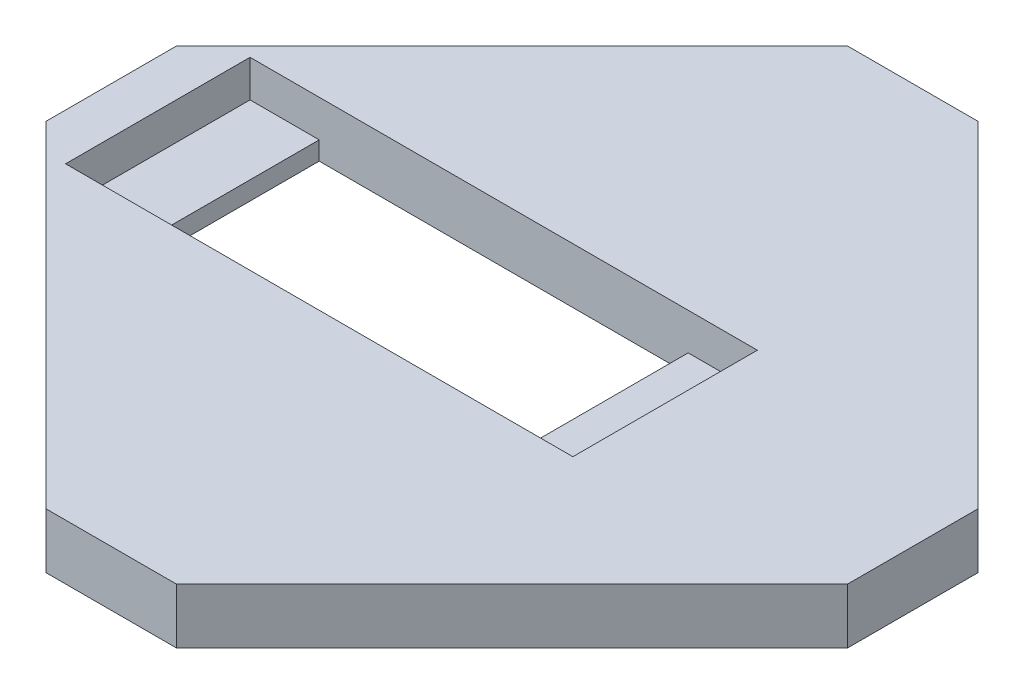
ISO-10303-21;
HEADER;
FILE_DESCRIPTION(('STEP AP214'),'2;1');
FILE_NAME('part.step','',(''),(''),'','','');
FILE_SCHEMA(('AUTOMOTIVE_DESIGN { 1 0 10303 214 1 1 1 1 }'));
ENDSEC;
DATA;
#1=APPLICATION_CONTEXT('core data for automotive mechanical design processes');
#2=APPLICATION_PROTOCOL_DEFINITION('international standard','automotive_design',2000,#1);
#3=PRODUCT_CONTEXT('',#1,'mechanical');
#4=PRODUCT('Part','Part','',(#3));
#5=PRODUCT_RELATED_PRODUCT_CATEGORY('part','',(#4));
#6=PRODUCT_DEFINITION_FORMATION('','',#4);
#7=PRODUCT_DEFINITION_CONTEXT('part definition',#1,'design');
#8=PRODUCT_DEFINITION('design','',#6,#7);
#9=PRODUCT_DEFINITION_SHAPE('','',#8);
#10=(LENGTH_UNIT() NAMED_UNIT(*) SI_UNIT(.MILLI.,.METRE.));
#11=(NAMED_UNIT(*) PLANE_ANGLE_UNIT() SI_UNIT($,.RADIAN.));
#12=(NAMED_UNIT(*) SI_UNIT($,.STERADIAN.) SOLID_ANGLE_UNIT());
#13=UNCERTAINTY_MEASURE_WITH_UNIT(LENGTH_MEASURE(1.E-05),#10,'distance_accuracy_value','');
#14=(GEOMETRIC_REPRESENTATION_CONTEXT(3) GLOBAL_UNCERTAINTY_ASSIGNED_CONTEXT((#13)) GLOBAL_UNIT_ASSIGNED_CONTEXT((#10,
#11,#12)) REPRESENTATION_CONTEXT('',''));
#15=CARTESIAN_POINT('',(0.,0.,0.));
#16=DIRECTION('',(0.,0.,1.));
#17=DIRECTION('',(1.,0.,0.));
#18=AXIS2_PLACEMENT_3D('',#15,#16,#17);
#19=CARTESIAN_POINT('',(0.,6.,-10.));
#20=DIRECTION('',(0.,0.,-1.));
#21=DIRECTION('',(-1.,0.,0.));
#22=AXIS2_PLACEMENT_3D('',#19,#20,#21);
#23=PLANE('',#22);
#24=DIRECTION('',(0.,-1.,0.));
#25=VECTOR('',#24,1.);
#26=CARTESIAN_POINT('',(-38.4,6.,-10.));
#27=LINE('',#26,#25);
#28=CARTESIAN_POINT('',(-38.4,6.,-10.));
#29=VERTEX_POINT('',#28);
#30=CARTESIAN_POINT('',(-38.4,2.,-10.));
#31=VERTEX_POINT('',#30);
#32=EDGE_CURVE('E178',#29,#31,#27,.T.);
#33=ORIENTED_EDGE('',*,*,#32,.T.);
#34=DIRECTION('',(1.,0.,0.));
#35=VECTOR('',#34,1.);
#36=CARTESIAN_POINT('',(0.,2.,-10.));
#37=LINE('',#36,#35);
#38=CARTESIAN_POINT('',(-30.9,2.,-10.));
#39=VERTEX_POINT('',#38);
#40=EDGE_CURVE('E171',#31,#39,#37,.T.);
#41=ORIENTED_EDGE('',*,*,#40,.T.);
#42=DIRECTION('',(0.,-1.,0.));
#43=VECTOR('',#42,1.);
#44=CARTESIAN_POINT('',(-30.9,2.,-10.));
#45=LINE('',#44,#43);
#46=CARTESIAN_POINT('',(-30.9,0.,-10.));
#47=VERTEX_POINT('',#46);
#48=EDGE_CURVE('E160',#39,#47,#45,.T.);
#49=ORIENTED_EDGE('',*,*,#48,.T.);
#50=DIRECTION('',(1.,0.,0.));
#51=VECTOR('',#50,1.);
#52=CARTESIAN_POINT('',(0.,0.,-10.));
#53=LINE('',#52,#51);
#54=CARTESIAN_POINT('',(9.1,0.,-10.));
#55=VERTEX_POINT('',#54);
#56=EDGE_CURVE('E203',#47,#55,#53,.T.);
#57=ORIENTED_EDGE('',*,*,#56,.T.);
#58=DIRECTION('',(0.,-1.,0.));
#59=VECTOR('',#58,1.);
#60=CARTESIAN_POINT('',(9.1,2.,-10.));
#61=LINE('',#60,#59);
#62=CARTESIAN_POINT('',(9.1,2.,-10.));
#63=VERTEX_POINT('',#62);
#64=EDGE_CURVE('E184',#63,#55,#61,.T.);
#65=ORIENTED_EDGE('',*,*,#64,.F.);
#66=DIRECTION('',(1.,0.,0.));
#67=VECTOR('',#66,1.);
#68=CARTESIAN_POINT('',(0.,2.,-10.));
#69=LINE('',#68,#67);
#70=CARTESIAN_POINT('',(16.6,2.,-10.));
#71=VERTEX_POINT('',#70);
#72=EDGE_CURVE('E190',#63,#71,#69,.T.);
#73=ORIENTED_EDGE('',*,*,#72,.T.);
#74=DIRECTION('',(0.,-1.,0.));
#75=VECTOR('',#74,1.);
#76=CARTESIAN_POINT('',(16.6,6.,-10.));
#77=LINE('',#76,#75);
#78=CARTESIAN_POINT('',(16.6,6.,-10.));
#79=VERTEX_POINT('',#78);
#80=EDGE_CURVE('E263',#79,#71,#77,.T.);
#81=ORIENTED_EDGE('',*,*,#80,.F.);
#82=DIRECTION('',(1.,0.,0.));
#83=VECTOR('',#82,1.);
#84=CARTESIAN_POINT('',(0.,6.,-10.));
#85=LINE('',#84,#83);
#86=EDGE_CURVE('E234',#29,#79,#85,.T.);
#87=ORIENTED_EDGE('',*,*,#86,.F.);
#88=EDGE_LOOP('',(#33,#41,#49,#57,#65,#73,#81,#87));
#89=FACE_BOUND('',#88,.T.);
#90=ADVANCED_FACE('F43',(#89),#23,.F.);
#91=CARTESIAN_POINT('',(16.6,6.,0.));
#92=DIRECTION('',(-1.,0.,0.));
#93=DIRECTION('',(0.,0.,1.));
#94=AXIS2_PLACEMENT_3D('',#91,#92,#93);
#95=PLANE('',#94);
#96=DIRECTION('',(0.,0.,-1.));
#97=VECTOR('',#96,1.);
#98=CARTESIAN_POINT('',(16.6,2.,0.));
#99=LINE('',#98,#97);
#100=CARTESIAN_POINT('',(16.6,2.,10.));
#101=VERTEX_POINT('',#100);
#102=EDGE_CURVE('E58',#101,#71,#99,.T.);
#103=ORIENTED_EDGE('',*,*,#102,.F.);
#104=DIRECTION('',(0.,-1.,0.));
#105=VECTOR('',#104,1.);
#106=CARTESIAN_POINT('',(16.6,6.,10.));
#107=LINE('',#106,#105);
#108=CARTESIAN_POINT('',(16.6,6.,10.));
#109=VERTEX_POINT('',#108);
#110=EDGE_CURVE('E11',#109,#101,#107,.T.);
#111=ORIENTED_EDGE('',*,*,#110,.F.);
#112=DIRECTION('',(0.,0.,-1.));
#113=VECTOR('',#112,1.);
#114=CARTESIAN_POINT('',(16.6,6.,0.));
#115=LINE('',#114,#113);
#116=EDGE_CURVE('E224',#109,#79,#115,.T.);
#117=ORIENTED_EDGE('',*,*,#116,.T.);
#118=ORIENTED_EDGE('',*,*,#80,.T.);
#119=EDGE_LOOP('',(#103,#111,#117,#118));
#120=FACE_BOUND('',#119,.T.);
#121=ADVANCED_FACE('F327',(#120),#95,.T.);
#122=CARTESIAN_POINT('',(0.,6.,10.));
#123=DIRECTION('',(0.,0.,-1.));
#124=DIRECTION('',(-1.,0.,0.));
#125=AXIS2_PLACEMENT_3D('',#122,#123,#124);
#126=PLANE('',#125);
#127=DIRECTION('',(0.,-1.,0.));
#128=VECTOR('',#127,1.);
#129=CARTESIAN_POINT('',(-30.9,2.,10.));
#130=LINE('',#129,#128);
#131=CARTESIAN_POINT('',(-30.9,2.,10.));
#132=VERTEX_POINT('',#131);
#133=CARTESIAN_POINT('',(-30.9,0.,10.));
#134=VERTEX_POINT('',#133);
#135=EDGE_CURVE('E170',#132,#134,#130,.T.);
#136=ORIENTED_EDGE('',*,*,#135,.F.);
#137=DIRECTION('',(1.,0.,0.));
#138=VECTOR('',#137,1.);
#139=CARTESIAN_POINT('',(0.,2.,10.));
#140=LINE('',#139,#138);
#141=CARTESIAN_POINT('',(-38.4,2.,10.));
#142=VERTEX_POINT('',#141);
#143=EDGE_CURVE('E172',#142,#132,#140,.T.);
#144=ORIENTED_EDGE('',*,*,#143,.F.);
#145=DIRECTION('',(0.,-1.,0.));
#146=VECTOR('',#145,1.);
#147=CARTESIAN_POINT('',(-38.4,6.,10.));
#148=LINE('',#147,#146);
#149=CARTESIAN_POINT('',(-38.4,6.,10.));
#150=VERTEX_POINT('',#149);
#151=EDGE_CURVE('E55',#150,#142,#148,.T.);
#152=ORIENTED_EDGE('',*,*,#151,.F.);
#153=DIRECTION('',(1.,0.,0.));
#154=VECTOR('',#153,1.);
#155=CARTESIAN_POINT('',(0.,6.,10.));
#156=LINE('',#155,#154);
#157=EDGE_CURVE('E226',#150,#109,#156,.T.);
#158=ORIENTED_EDGE('',*,*,#157,.T.);
#159=ORIENTED_EDGE('',*,*,#110,.T.);
#160=DIRECTION('',(1.,0.,0.));
#161=VECTOR('',#160,1.);
#162=CARTESIAN_POINT('',(0.,2.,10.));
#163=LINE('',#162,#161);
#164=CARTESIAN_POINT('',(9.1,2.,10.));
#165=VERTEX_POINT('',#164);
#166=EDGE_CURVE('E191',#165,#101,#163,.T.);
#167=ORIENTED_EDGE('',*,*,#166,.F.);
#168=DIRECTION('',(0.,-1.,0.));
#169=VECTOR('',#168,1.);
#170=CARTESIAN_POINT('',(9.1,2.,10.));
#171=LINE('',#170,#169);
#172=CARTESIAN_POINT('',(9.1,0.,10.));
#173=VERTEX_POINT('',#172);
#174=EDGE_CURVE('E192',#165,#173,#171,.T.);
#175=ORIENTED_EDGE('',*,*,#174,.T.);
#176=DIRECTION('',(1.,0.,0.));
#177=VECTOR('',#176,1.);
#178=CARTESIAN_POINT('',(0.,0.,10.));
#179=LINE('',#178,#177);
#180=EDGE_CURVE('E257',#134,#173,#179,.T.);
#181=ORIENTED_EDGE('',*,*,#180,.F.);
#182=EDGE_LOOP('',(#136,#144,#152,#158,#159,#167,#175,#181));
#183=FACE_BOUND('',#182,.T.);
#184=ADVANCED_FACE('F335',(#183),#126,.T.);
#185=CARTESIAN_POINT('',(-38.4,6.,0.));
#186=DIRECTION('',(-1.,0.,0.));
#187=DIRECTION('',(0.,0.,1.));
#188=AXIS2_PLACEMENT_3D('',#185,#186,#187);
#189=PLANE('',#188);
#190=ORIENTED_EDGE('',*,*,#151,.T.);
#191=DIRECTION('',(0.,0.,-1.));
#192=VECTOR('',#191,1.);
#193=CARTESIAN_POINT('',(-38.4,2.,0.));
#194=LINE('',#193,#192);
#195=EDGE_CURVE('E177',#142,#31,#194,.T.);
#196=ORIENTED_EDGE('',*,*,#195,.T.);
#197=ORIENTED_EDGE('',*,*,#32,.F.);
#198=DIRECTION('',(0.,0.,-1.));
#199=VECTOR('',#198,1.);
#200=CARTESIAN_POINT('',(-38.4,6.,0.));
#201=LINE('',#200,#199);
#202=EDGE_CURVE('E233',#150,#29,#201,.T.);
#203=ORIENTED_EDGE('',*,*,#202,.F.);
#204=EDGE_LOOP('',(#190,#196,#197,#203));
#205=FACE_BOUND('',#204,.T.);
#206=ADVANCED_FACE('F337',(#205),#189,.F.);
#207=CARTESIAN_POINT('',(0.,6.,43.4502525316942));
#208=DIRECTION('',(0.,0.,1.));
#209=DIRECTION('',(1.,0.,0.));
#210=AXIS2_PLACEMENT_3D('',#207,#208,#209);
#211=PLANE('',#210);
#212=DIRECTION('',(-1.,0.,0.));
#213=VECTOR('',#212,1.);
#214=CARTESIAN_POINT('',(0.,0.,43.4502525316942));
#215=LINE('',#214,#213);
#216=CARTESIAN_POINT('',(7.07106781186549,0.,43.4502525316942));
#217=VERTEX_POINT('',#216);
#218=CARTESIAN_POINT('',(-7.07106781186546,0.,43.4502525316942));
#219=VERTEX_POINT('',#218);
#220=EDGE_CURVE('E168',#217,#219,#215,.T.);
#221=ORIENTED_EDGE('',*,*,#220,.F.);
#222=DIRECTION('',(0.,-1.,0.));
#223=VECTOR('',#222,1.);
#224=CARTESIAN_POINT('',(7.07106781186549,6.,43.4502525316942));
#225=LINE('',#224,#223);
#226=CARTESIAN_POINT('',(7.07106781186549,6.,43.4502525316942));
#227=VERTEX_POINT('',#226);
#228=EDGE_CURVE('E50',#227,#217,#225,.T.);
#229=ORIENTED_EDGE('',*,*,#228,.F.);
#230=DIRECTION('',(-1.,0.,0.));
#231=VECTOR('',#230,1.);
#232=CARTESIAN_POINT('',(0.,6.,43.4502525316942));
#233=LINE('',#232,#231);
#234=CARTESIAN_POINT('',(-7.07106781186546,6.,43.4502525316942));
#235=VERTEX_POINT('',#234);
#236=EDGE_CURVE('E200',#227,#235,#233,.T.);
#237=ORIENTED_EDGE('',*,*,#236,.T.);
#238=DIRECTION('',(0.,-1.,0.));
#239=VECTOR('',#238,1.);
#240=CARTESIAN_POINT('',(-7.07106781186546,6.,43.4502525316942));
#241=LINE('',#240,#239);
#242=EDGE_CURVE('E236',#235,#219,#241,.T.);
#243=ORIENTED_EDGE('',*,*,#242,.T.);
#244=EDGE_LOOP('',(#221,#229,#237,#243));
#245=FACE_BOUND('',#244,.T.);
#246=ADVANCED_FACE('F44',(#245),#211,.T.);
#247=CARTESIAN_POINT('',(25.2606601717798,6.,25.2606601717798));
#248=DIRECTION('',(0.707106781186547,0.,0.707106781186547));
#249=DIRECTION('',(0.707106781186548,0.,-0.707106781186548));
#250=AXIS2_PLACEMENT_3D('',#247,#248,#249);
#251=PLANE('',#250);
#252=DIRECTION('',(-0.707106781186548,0.,0.707106781186548));
#253=VECTOR('',#252,1.);
#254=CARTESIAN_POINT('',(25.2606601717798,0.,25.2606601717798));
#255=LINE('',#254,#253);
#256=CARTESIAN_POINT('',(43.4502525316942,0.,7.07106781186547));
#257=VERTEX_POINT('',#256);
#258=EDGE_CURVE('E237',#257,#217,#255,.T.);
#259=ORIENTED_EDGE('',*,*,#258,.F.);
#260=DIRECTION('',(0.,-1.,0.));
#261=VECTOR('',#260,1.);
#262=CARTESIAN_POINT('',(43.4502525316942,6.,7.07106781186547));
#263=LINE('',#262,#261);
#264=CARTESIAN_POINT('',(43.4502525316942,6.,7.07106781186547));
#265=VERTEX_POINT('',#264);
#266=EDGE_CURVE('E277',#265,#257,#263,.T.);
#267=ORIENTED_EDGE('',*,*,#266,.F.);
#268=DIRECTION('',(-0.707106781186548,0.,0.707106781186548));
#269=VECTOR('',#268,1.);
#270=CARTESIAN_POINT('',(25.2606601717798,6.,25.2606601717798));
#271=LINE('',#270,#269);
#272=EDGE_CURVE('E202',#265,#227,#271,.T.);
#273=ORIENTED_EDGE('',*,*,#272,.T.);
#274=ORIENTED_EDGE('',*,*,#228,.T.);
#275=EDGE_LOOP('',(#259,#267,#273,#274));
#276=FACE_BOUND('',#275,.T.);
#277=ADVANCED_FACE('F286',(#276),#251,.T.);
#278=CARTESIAN_POINT('',(43.4502525316942,6.,0.));
#279=DIRECTION('',(1.,0.,0.));
#280=DIRECTION('',(0.,0.,-1.));
#281=AXIS2_PLACEMENT_3D('',#278,#279,#280);
#282=PLANE('',#281);
#283=DIRECTION('',(0.,0.,1.));
#284=VECTOR('',#283,1.);
#285=CARTESIAN_POINT('',(43.4502525316942,0.,0.));
#286=LINE('',#285,#284);
#287=CARTESIAN_POINT('',(43.4502525316942,0.,-7.07106781186547));
#288=VERTEX_POINT('',#287);
#289=EDGE_CURVE('E245',#288,#257,#286,.T.);
#290=ORIENTED_EDGE('',*,*,#289,.F.);
#291=DIRECTION('',(0.,-1.,0.));
#292=VECTOR('',#291,1.);
#293=CARTESIAN_POINT('',(43.4502525316942,6.,-7.07106781186547));
#294=LINE('',#293,#292);
#295=CARTESIAN_POINT('',(43.4502525316942,6.,-7.07106781186547));
#296=VERTEX_POINT('',#295);
#297=EDGE_CURVE('E278',#296,#288,#294,.T.);
#298=ORIENTED_EDGE('',*,*,#297,.F.);
#299=DIRECTION('',(0.,0.,1.));
#300=VECTOR('',#299,1.);
#301=CARTESIAN_POINT('',(43.4502525316942,6.,0.));
#302=LINE('',#301,#300);
#303=EDGE_CURVE('E210',#296,#265,#302,.T.);
#304=ORIENTED_EDGE('',*,*,#303,.T.);
#305=ORIENTED_EDGE('',*,*,#266,.T.);
#306=EDGE_LOOP('',(#290,#298,#304,#305));
#307=FACE_BOUND('',#306,.T.);
#308=ADVANCED_FACE('F295',(#307),#282,.T.);
#309=CARTESIAN_POINT('',(25.2606601717798,6.,-25.2606601717798));
#310=DIRECTION('',(0.707106781186547,0.,-0.707106781186548));
#311=DIRECTION('',(-0.707106781186548,0.,-0.707106781186547));
#312=AXIS2_PLACEMENT_3D('',#309,#310,#311);
#313=PLANE('',#312);
#314=DIRECTION('',(0.707106781186548,0.,0.707106781186547));
#315=VECTOR('',#314,1.);
#316=CARTESIAN_POINT('',(25.2606601717798,0.,-25.2606601717798));
#317=LINE('',#316,#315);
#318=CARTESIAN_POINT('',(7.07106781186548,0.,-43.4502525316942));
#319=VERTEX_POINT('',#318);
#320=EDGE_CURVE('E244',#319,#288,#317,.T.);
#321=ORIENTED_EDGE('',*,*,#320,.F.);
#322=DIRECTION('',(0.,-1.,0.));
#323=VECTOR('',#322,1.);
#324=CARTESIAN_POINT('',(7.07106781186548,6.,-43.4502525316942));
#325=LINE('',#324,#323);
#326=CARTESIAN_POINT('',(7.07106781186548,6.,-43.4502525316942));
#327=VERTEX_POINT('',#326);
#328=EDGE_CURVE('E276',#327,#319,#325,.T.);
#329=ORIENTED_EDGE('',*,*,#328,.F.);
#330=DIRECTION('',(0.707106781186548,0.,0.707106781186547));
#331=VECTOR('',#330,1.);
#332=CARTESIAN_POINT('',(25.2606601717798,6.,-25.2606601717798));
#333=LINE('',#332,#331);
#334=EDGE_CURVE('E208',#327,#296,#333,.T.);
#335=ORIENTED_EDGE('',*,*,#334,.T.);
#336=ORIENTED_EDGE('',*,*,#297,.T.);
#337=EDGE_LOOP('',(#321,#329,#335,#336));
#338=FACE_BOUND('',#337,.T.);
#339=ADVANCED_FACE('F305',(#338),#313,.T.);
#340=CARTESIAN_POINT('',(0.,6.,-43.4502525316942));
#341=DIRECTION('',(0.,0.,-1.));
#342=DIRECTION('',(-1.,0.,0.));
#343=AXIS2_PLACEMENT_3D('',#340,#341,#342);
#344=PLANE('',#343);
#345=DIRECTION('',(1.,0.,0.));
#346=VECTOR('',#345,1.);
#347=CARTESIAN_POINT('',(0.,0.,-43.4502525316942));
#348=LINE('',#347,#346);
#349=CARTESIAN_POINT('',(-7.07106781186548,0.,-43.4502525316942));
#350=VERTEX_POINT('',#349);
#351=EDGE_CURVE('E247',#350,#319,#348,.T.);
#352=ORIENTED_EDGE('',*,*,#351,.F.);
#353=DIRECTION('',(0.,-1.,0.));
#354=VECTOR('',#353,1.);
#355=CARTESIAN_POINT('',(-7.07106781186548,6.,-43.4502525316942));
#356=LINE('',#355,#354);
#357=CARTESIAN_POINT('',(-7.07106781186548,6.,-43.4502525316942));
#358=VERTEX_POINT('',#357);
#359=EDGE_CURVE('E273',#358,#350,#356,.T.);
#360=ORIENTED_EDGE('',*,*,#359,.F.);
#361=DIRECTION('',(1.,0.,0.));
#362=VECTOR('',#361,1.);
#363=CARTESIAN_POINT('',(0.,6.,-43.4502525316942));
#364=LINE('',#363,#362);
#365=EDGE_CURVE('E215',#358,#327,#364,.T.);
#366=ORIENTED_EDGE('',*,*,#365,.T.);
#367=ORIENTED_EDGE('',*,*,#328,.T.);
#368=EDGE_LOOP('',(#352,#360,#366,#367));
#369=FACE_BOUND('',#368,.T.);
#370=ADVANCED_FACE('F304',(#369),#344,.T.);
#371=CARTESIAN_POINT('',(-25.2606601717798,6.,-25.2606601717798));
#372=DIRECTION('',(-0.707106781186547,0.,-0.707106781186547));
#373=DIRECTION('',(-0.707106781186548,0.,0.707106781186548));
#374=AXIS2_PLACEMENT_3D('',#371,#372,#373);
#375=PLANE('',#374);
#376=DIRECTION('',(0.707106781186548,0.,-0.707106781186548));
#377=VECTOR('',#376,1.);
#378=CARTESIAN_POINT('',(-25.2606601717798,0.,-25.2606601717798));
#379=LINE('',#378,#377);
#380=CARTESIAN_POINT('',(-43.4502525316942,0.,-7.07106781186547));
#381=VERTEX_POINT('',#380);
#382=EDGE_CURVE('E252',#381,#350,#379,.T.);
#383=ORIENTED_EDGE('',*,*,#382,.F.);
#384=DIRECTION('',(0.,-1.,0.));
#385=VECTOR('',#384,1.);
#386=CARTESIAN_POINT('',(-43.4502525316942,6.,-7.07106781186547));
#387=LINE('',#386,#385);
#388=CARTESIAN_POINT('',(-43.4502525316942,6.,-7.07106781186547));
#389=VERTEX_POINT('',#388);
#390=EDGE_CURVE('E271',#389,#381,#387,.T.);
#391=ORIENTED_EDGE('',*,*,#390,.F.);
#392=DIRECTION('',(0.707106781186548,0.,-0.707106781186548));
#393=VECTOR('',#392,1.);
#394=CARTESIAN_POINT('',(-25.2606601717798,6.,-25.2606601717798));
#395=LINE('',#394,#393);
#396=EDGE_CURVE('E216',#389,#358,#395,.T.);
#397=ORIENTED_EDGE('',*,*,#396,.T.);
#398=ORIENTED_EDGE('',*,*,#359,.T.);
#399=EDGE_LOOP('',(#383,#391,#397,#398));
#400=FACE_BOUND('',#399,.T.);
#401=ADVANCED_FACE('F309',(#400),#375,.T.);
#402=CARTESIAN_POINT('',(-43.4502525316942,6.,0.));
#403=DIRECTION('',(-1.,0.,0.));
#404=DIRECTION('',(0.,0.,1.));
#405=AXIS2_PLACEMENT_3D('',#402,#403,#404);
#406=PLANE('',#405);
#407=DIRECTION('',(0.,0.,-1.));
#408=VECTOR('',#407,1.);
#409=CARTESIAN_POINT('',(-43.4502525316942,0.,0.));
#410=LINE('',#409,#408);
#411=CARTESIAN_POINT('',(-43.4502525316942,0.,7.07106781186547));
#412=VERTEX_POINT('',#411);
#413=EDGE_CURVE('E251',#412,#381,#410,.T.);
#414=ORIENTED_EDGE('',*,*,#413,.F.);
#415=DIRECTION('',(0.,-1.,0.));
#416=VECTOR('',#415,1.);
#417=CARTESIAN_POINT('',(-43.4502525316942,6.,7.07106781186547));
#418=LINE('',#417,#416);
#419=CARTESIAN_POINT('',(-43.4502525316942,6.,7.07106781186547));
#420=VERTEX_POINT('',#419);
#421=EDGE_CURVE('E272',#420,#412,#418,.T.);
#422=ORIENTED_EDGE('',*,*,#421,.F.);
#423=DIRECTION('',(0.,0.,-1.));
#424=VECTOR('',#423,1.);
#425=CARTESIAN_POINT('',(-43.4502525316942,6.,0.));
#426=LINE('',#425,#424);
#427=EDGE_CURVE('E218',#420,#389,#426,.T.);
#428=ORIENTED_EDGE('',*,*,#427,.T.);
#429=ORIENTED_EDGE('',*,*,#390,.T.);
#430=EDGE_LOOP('',(#414,#422,#428,#429));
#431=FACE_BOUND('',#430,.T.);
#432=ADVANCED_FACE('F312',(#431),#406,.T.);
#433=CARTESIAN_POINT('',(-25.2606601717798,6.,25.2606601717798));
#434=DIRECTION('',(-0.707106781186547,0.,0.707106781186547));
#435=DIRECTION('',(0.707106781186548,0.,0.707106781186548));
#436=AXIS2_PLACEMENT_3D('',#433,#434,#435);
#437=PLANE('',#436);
#438=DIRECTION('',(-0.707106781186548,0.,-0.707106781186548));
#439=VECTOR('',#438,1.);
#440=CARTESIAN_POINT('',(-25.2606601717798,0.,25.2606601717798));
#441=LINE('',#440,#439);
#442=EDGE_CURVE('E256',#219,#412,#441,.T.);
#443=ORIENTED_EDGE('',*,*,#442,.F.);
#444=ORIENTED_EDGE('',*,*,#242,.F.);
#445=DIRECTION('',(-0.707106781186548,0.,-0.707106781186548));
#446=VECTOR('',#445,1.);
#447=CARTESIAN_POINT('',(-25.2606601717798,6.,25.2606601717798));
#448=LINE('',#447,#446);
#449=EDGE_CURVE('E225',#235,#420,#448,.T.);
#450=ORIENTED_EDGE('',*,*,#449,.T.);
#451=ORIENTED_EDGE('',*,*,#421,.T.);
#452=EDGE_LOOP('',(#443,#444,#450,#451));
#453=FACE_BOUND('',#452,.T.);
#454=ADVANCED_FACE('F317',(#453),#437,.T.);
#455=CARTESIAN_POINT('',(0.,6.,0.));
#456=DIRECTION('',(0.,1.,0.));
#457=DIRECTION('',(0.,0.,1.));
#458=AXIS2_PLACEMENT_3D('',#455,#456,#457);
#459=PLANE('',#458);
#460=ORIENTED_EDGE('',*,*,#236,.F.);
#461=ORIENTED_EDGE('',*,*,#272,.F.);
#462=ORIENTED_EDGE('',*,*,#303,.F.);
#463=ORIENTED_EDGE('',*,*,#334,.F.);
#464=ORIENTED_EDGE('',*,*,#365,.F.);
#465=ORIENTED_EDGE('',*,*,#396,.F.);
#466=ORIENTED_EDGE('',*,*,#427,.F.);
#467=ORIENTED_EDGE('',*,*,#449,.F.);
#468=EDGE_LOOP('',(#460,#461,#462,#463,#464,#465,#466,#467));
#469=FACE_BOUND('',#468,.T.);
#470=ORIENTED_EDGE('',*,*,#116,.F.);
#471=ORIENTED_EDGE('',*,*,#157,.F.);
#472=ORIENTED_EDGE('',*,*,#202,.T.);
#473=ORIENTED_EDGE('',*,*,#86,.T.);
#474=EDGE_LOOP('',(#470,#471,#472,#473));
#475=FACE_BOUND('',#474,.T.);
#476=ADVANCED_FACE('F299',(#469,#475),#459,.T.);
#477=CARTESIAN_POINT('',(0.,0.,0.));
#478=DIRECTION('',(0.,1.,0.));
#479=DIRECTION('',(0.,0.,1.));
#480=AXIS2_PLACEMENT_3D('',#477,#478,#479);
#481=PLANE('',#480);
#482=DIRECTION('',(0.,0.,1.));
#483=VECTOR('',#482,1.);
#484=CARTESIAN_POINT('',(-30.9,0.,0.));
#485=LINE('',#484,#483);
#486=EDGE_CURVE('E69',#47,#134,#485,.T.);
#487=ORIENTED_EDGE('',*,*,#486,.T.);
#488=ORIENTED_EDGE('',*,*,#180,.T.);
#489=DIRECTION('',(0.,0.,1.));
#490=VECTOR('',#489,1.);
#491=CARTESIAN_POINT('',(9.1,0.,0.));
#492=LINE('',#491,#490);
#493=EDGE_CURVE('E188',#55,#173,#492,.T.);
#494=ORIENTED_EDGE('',*,*,#493,.F.);
#495=ORIENTED_EDGE('',*,*,#56,.F.);
#496=EDGE_LOOP('',(#487,#488,#494,#495));
#497=FACE_BOUND('',#496,.T.);
#498=ORIENTED_EDGE('',*,*,#220,.T.);
#499=ORIENTED_EDGE('',*,*,#442,.T.);
#500=ORIENTED_EDGE('',*,*,#413,.T.);
#501=ORIENTED_EDGE('',*,*,#382,.T.);
#502=ORIENTED_EDGE('',*,*,#351,.T.);
#503=ORIENTED_EDGE('',*,*,#320,.T.);
#504=ORIENTED_EDGE('',*,*,#289,.T.);
#505=ORIENTED_EDGE('',*,*,#258,.T.);
#506=EDGE_LOOP('',(#498,#499,#500,#501,#502,#503,#504,#505));
#507=FACE_BOUND('',#506,.T.);
#508=ADVANCED_FACE('F292',(#497,#507),#481,.F.);
#509=CARTESIAN_POINT('',(9.1,2.,0.));
#510=DIRECTION('',(1.,0.,0.));
#511=DIRECTION('',(0.,0.,-1.));
#512=AXIS2_PLACEMENT_3D('',#509,#510,#511);
#513=PLANE('',#512);
#514=ORIENTED_EDGE('',*,*,#493,.T.);
#515=ORIENTED_EDGE('',*,*,#174,.F.);
#516=DIRECTION('',(0.,0.,1.));
#517=VECTOR('',#516,1.);
#518=CARTESIAN_POINT('',(9.1,2.,0.));
#519=LINE('',#518,#517);
#520=EDGE_CURVE('E186',#63,#165,#519,.T.);
#521=ORIENTED_EDGE('',*,*,#520,.F.);
#522=ORIENTED_EDGE('',*,*,#64,.T.);
#523=EDGE_LOOP('',(#514,#515,#521,#522));
#524=FACE_BOUND('',#523,.T.);
#525=ADVANCED_FACE('F350',(#524),#513,.F.);
#526=CARTESIAN_POINT('',(0.,2.,0.));
#527=DIRECTION('',(0.,1.,0.));
#528=DIRECTION('',(0.,0.,1.));
#529=AXIS2_PLACEMENT_3D('',#526,#527,#528);
#530=PLANE('',#529);
#531=ORIENTED_EDGE('',*,*,#72,.F.);
#532=ORIENTED_EDGE('',*,*,#520,.T.);
#533=ORIENTED_EDGE('',*,*,#166,.T.);
#534=ORIENTED_EDGE('',*,*,#102,.T.);
#535=EDGE_LOOP('',(#531,#532,#533,#534));
#536=FACE_BOUND('',#535,.T.);
#537=ADVANCED_FACE('F352',(#536),#530,.T.);
#538=CARTESIAN_POINT('',(-30.9,2.,0.));
#539=DIRECTION('',(1.,0.,0.));
#540=DIRECTION('',(0.,0.,-1.));
#541=AXIS2_PLACEMENT_3D('',#538,#539,#540);
#542=PLANE('',#541);
#543=ORIENTED_EDGE('',*,*,#486,.F.);
#544=ORIENTED_EDGE('',*,*,#48,.F.);
#545=DIRECTION('',(0.,0.,1.));
#546=VECTOR('',#545,1.);
#547=CARTESIAN_POINT('',(-30.9,2.,0.));
#548=LINE('',#547,#546);
#549=EDGE_CURVE('E159',#39,#132,#548,.T.);
#550=ORIENTED_EDGE('',*,*,#549,.T.);
#551=ORIENTED_EDGE('',*,*,#135,.T.);
#552=EDGE_LOOP('',(#543,#544,#550,#551));
#553=FACE_BOUND('',#552,.T.);
#554=ADVANCED_FACE('F158',(#553),#542,.T.);
#555=CARTESIAN_POINT('',(0.,2.,0.));
#556=DIRECTION('',(0.,1.,0.));
#557=DIRECTION('',(0.,0.,1.));
#558=AXIS2_PLACEMENT_3D('',#555,#556,#557);
#559=PLANE('',#558);
#560=ORIENTED_EDGE('',*,*,#549,.F.);
#561=ORIENTED_EDGE('',*,*,#40,.F.);
#562=ORIENTED_EDGE('',*,*,#195,.F.);
#563=ORIENTED_EDGE('',*,*,#143,.T.);
#564=EDGE_LOOP('',(#560,#561,#562,#563));
#565=FACE_BOUND('',#564,.T.);
#566=ADVANCED_FACE('F167',(#565),#559,.T.);
#567=CLOSED_SHELL('',(#90,#121,#184,#206,#246,#277,#308,#339,#370,#401,#432,#454,#476,#508,#525,
#537,#554,#566));
#568=MANIFOLD_SOLID_BREP('B2',#567);
#569=ADVANCED_BREP_SHAPE_REPRESENTATION('',(#18,#568),#14);
#570=SHAPE_DEFINITION_REPRESENTATION(#9,#569);
ENDSEC;
END-ISO-10303-21;
